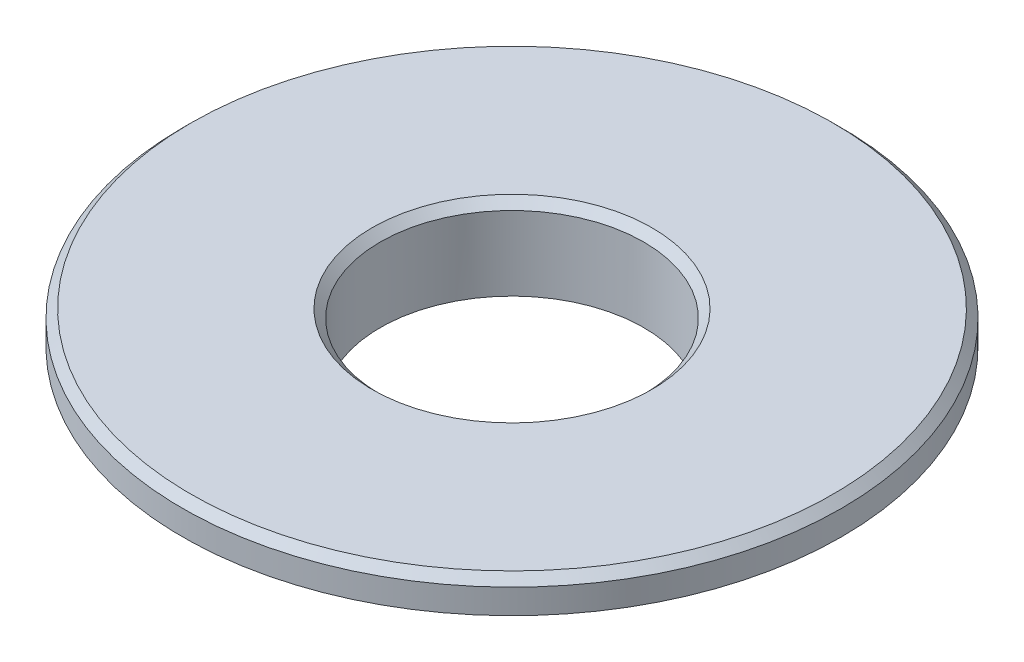
ISO-10303-21;
HEADER;
FILE_DESCRIPTION(('STEP AP214'),'2;1');
FILE_NAME('part.step','',(''),(''),'','','');
FILE_SCHEMA(('AUTOMOTIVE_DESIGN { 1 0 10303 214 1 1 1 1 }'));
ENDSEC;
DATA;
#1=APPLICATION_CONTEXT('core data for automotive mechanical design processes');
#2=APPLICATION_PROTOCOL_DEFINITION('international standard','automotive_design',2000,#1);
#3=PRODUCT_CONTEXT('',#1,'mechanical');
#4=PRODUCT('Part','Part','',(#3));
#5=PRODUCT_RELATED_PRODUCT_CATEGORY('part','',(#4));
#6=PRODUCT_DEFINITION_FORMATION('','',#4);
#7=PRODUCT_DEFINITION_CONTEXT('part definition',#1,'design');
#8=PRODUCT_DEFINITION('design','',#6,#7);
#9=PRODUCT_DEFINITION_SHAPE('','',#8);
#10=(LENGTH_UNIT() NAMED_UNIT(*) SI_UNIT(.MILLI.,.METRE.));
#11=(NAMED_UNIT(*) PLANE_ANGLE_UNIT() SI_UNIT($,.RADIAN.));
#12=(NAMED_UNIT(*) SI_UNIT($,.STERADIAN.) SOLID_ANGLE_UNIT());
#13=UNCERTAINTY_MEASURE_WITH_UNIT(LENGTH_MEASURE(1.E-05),#10,'distance_accuracy_value','');
#14=(GEOMETRIC_REPRESENTATION_CONTEXT(3) GLOBAL_UNCERTAINTY_ASSIGNED_CONTEXT((#13)) GLOBAL_UNIT_ASSIGNED_CONTEXT((#10,
#11,#12)) REPRESENTATION_CONTEXT('',''));
#15=CARTESIAN_POINT('',(0.,0.,0.));
#16=DIRECTION('',(0.,0.,1.));
#17=DIRECTION('',(1.,0.,0.));
#18=AXIS2_PLACEMENT_3D('',#15,#16,#17);
#19=CARTESIAN_POINT('',(0.,-42.9737261146497,0.));
#20=DIRECTION('',(0.,-1.,0.));
#21=DIRECTION('',(1.,0.,0.));
#22=AXIS2_PLACEMENT_3D('',#19,#20,#21);
#23=CYLINDRICAL_SURFACE('',#22,8.);
#24=CARTESIAN_POINT('',(0.,-0.5,0.));
#25=DIRECTION('',(0.,1.,0.));
#26=DIRECTION('',(-1.,0.,0.));
#27=AXIS2_PLACEMENT_3D('',#24,#25,#26);
#28=CIRCLE('',#27,8.);
#29=CARTESIAN_POINT('',(-7.99999999999999,-0.500000000000002,0.));
#30=VERTEX_POINT('',#29);
#31=EDGE_CURVE('E40',#30,#30,#28,.T.);
#32=ORIENTED_EDGE('',*,*,#31,.T.);
#33=EDGE_LOOP('',(#32));
#34=FACE_BOUND('',#33,.T.);
#35=CARTESIAN_POINT('',(0.,-5.00000000000001,0.));
#36=DIRECTION('',(0.,-1.,0.));
#37=DIRECTION('',(1.,0.,0.));
#38=AXIS2_PLACEMENT_3D('',#35,#36,#37);
#39=CIRCLE('',#38,8.);
#40=CARTESIAN_POINT('',(8.00000000000001,-5.00000000000001,0.));
#41=VERTEX_POINT('',#40);
#42=EDGE_CURVE('E65',#41,#41,#39,.T.);
#43=ORIENTED_EDGE('',*,*,#42,.T.);
#44=EDGE_LOOP('',(#43));
#45=FACE_BOUND('',#44,.T.);
#46=ADVANCED_FACE('F33',(#34,#45),#23,.F.);
#47=CARTESIAN_POINT('',(8.,0.,0.));
#48=DIRECTION('',(0.,1.,0.));
#49=DIRECTION('',(-1.,0.,0.));
#50=AXIS2_PLACEMENT_3D('',#47,#48,#49);
#51=PLANE('',#50);
#52=CARTESIAN_POINT('',(0.,0.,0.));
#53=DIRECTION('',(0.,1.,0.));
#54=DIRECTION('',(-1.,0.,0.));
#55=AXIS2_PLACEMENT_3D('',#52,#53,#54);
#56=CIRCLE('',#55,8.49999999999999);
#57=CARTESIAN_POINT('',(-8.49999999999998,0.,0.));
#58=VERTEX_POINT('',#57);
#59=EDGE_CURVE('E44',#58,#58,#56,.F.);
#60=ORIENTED_EDGE('',*,*,#59,.T.);
#61=EDGE_LOOP('',(#60));
#62=FACE_BOUND('',#61,.T.);
#63=CARTESIAN_POINT('',(0.,0.,0.));
#64=DIRECTION('',(0.,1.,0.));
#65=DIRECTION('',(-1.,0.,0.));
#66=AXIS2_PLACEMENT_3D('',#63,#64,#65);
#67=CIRCLE('',#66,19.5);
#68=CARTESIAN_POINT('',(-19.5,0.,0.));
#69=VERTEX_POINT('',#68);
#70=EDGE_CURVE('E48',#69,#69,#67,.T.);
#71=ORIENTED_EDGE('',*,*,#70,.T.);
#72=EDGE_LOOP('',(#71));
#73=FACE_BOUND('',#72,.T.);
#74=ADVANCED_FACE('F87',(#62,#73),#51,.T.);
#75=CARTESIAN_POINT('',(0.,-42.9737261146497,0.));
#76=DIRECTION('',(0.,-1.,0.));
#77=DIRECTION('',(1.,0.,0.));
#78=AXIS2_PLACEMENT_3D('',#75,#76,#77);
#79=CYLINDRICAL_SURFACE('',#78,20.);
#80=CARTESIAN_POINT('',(0.,-0.500000000000014,0.));
#81=DIRECTION('',(0.,1.,0.));
#82=DIRECTION('',(-1.,0.,0.));
#83=AXIS2_PLACEMENT_3D('',#80,#81,#82);
#84=CIRCLE('',#83,20.);
#85=CARTESIAN_POINT('',(-20.,-0.500000000000018,0.));
#86=VERTEX_POINT('',#85);
#87=EDGE_CURVE('E10',#86,#86,#84,.F.);
#88=ORIENTED_EDGE('',*,*,#87,.T.);
#89=EDGE_LOOP('',(#88));
#90=FACE_BOUND('',#89,.T.);
#91=CARTESIAN_POINT('',(0.,-2.00000000000001,0.));
#92=DIRECTION('',(0.,-1.,0.));
#93=DIRECTION('',(1.,0.,0.));
#94=AXIS2_PLACEMENT_3D('',#91,#92,#93);
#95=CIRCLE('',#94,20.);
#96=CARTESIAN_POINT('',(20.,-2.00000000000001,0.));
#97=VERTEX_POINT('',#96);
#98=EDGE_CURVE('E59',#97,#97,#95,.T.);
#99=ORIENTED_EDGE('',*,*,#98,.F.);
#100=EDGE_LOOP('',(#99));
#101=FACE_BOUND('',#100,.T.);
#102=ADVANCED_FACE('F92',(#90,#101),#79,.T.);
#103=CARTESIAN_POINT('',(20.,-2.,0.));
#104=DIRECTION('',(0.,-1.,0.));
#105=DIRECTION('',(1.,0.,0.));
#106=AXIS2_PLACEMENT_3D('',#103,#104,#105);
#107=PLANE('',#106);
#108=ORIENTED_EDGE('',*,*,#98,.T.);
#109=EDGE_LOOP('',(#108));
#110=FACE_BOUND('',#109,.T.);
#111=CARTESIAN_POINT('',(0.,-2.00000000000001,0.));
#112=DIRECTION('',(0.,-1.,0.));
#113=DIRECTION('',(1.,0.,0.));
#114=AXIS2_PLACEMENT_3D('',#111,#112,#113);
#115=CIRCLE('',#114,9.5);
#116=CARTESIAN_POINT('',(9.50000000000001,-2.00000000000001,0.));
#117=VERTEX_POINT('',#116);
#118=EDGE_CURVE('E62',#117,#117,#115,.T.);
#119=ORIENTED_EDGE('',*,*,#118,.F.);
#120=EDGE_LOOP('',(#119));
#121=FACE_BOUND('',#120,.T.);
#122=ADVANCED_FACE('F83',(#110,#121),#107,.T.);
#123=CARTESIAN_POINT('',(0.,-42.9737261146497,0.));
#124=DIRECTION('',(0.,-1.,0.));
#125=DIRECTION('',(1.,0.,0.));
#126=AXIS2_PLACEMENT_3D('',#123,#124,#125);
#127=CYLINDRICAL_SURFACE('',#126,9.5);
#128=CARTESIAN_POINT('',(0.,-4.50000000000002,0.));
#129=DIRECTION('',(0.,-1.,0.));
#130=DIRECTION('',(1.,0.,0.));
#131=AXIS2_PLACEMENT_3D('',#128,#129,#130);
#132=CIRCLE('',#131,9.5);
#133=CARTESIAN_POINT('',(9.50000000000001,-4.50000000000002,0.));
#134=VERTEX_POINT('',#133);
#135=EDGE_CURVE('E53',#134,#134,#132,.F.);
#136=ORIENTED_EDGE('',*,*,#135,.T.);
#137=EDGE_LOOP('',(#136));
#138=FACE_BOUND('',#137,.T.);
#139=ORIENTED_EDGE('',*,*,#118,.T.);
#140=EDGE_LOOP('',(#139));
#141=FACE_BOUND('',#140,.T.);
#142=ADVANCED_FACE('F73',(#138,#141),#127,.T.);
#143=CARTESIAN_POINT('',(9.50000000000001,-5.00000000000001,0.));
#144=DIRECTION('',(0.,-1.,0.));
#145=DIRECTION('',(1.,0.,0.));
#146=AXIS2_PLACEMENT_3D('',#143,#144,#145);
#147=PLANE('',#146);
#148=CARTESIAN_POINT('',(0.,-5.00000000000001,0.));
#149=DIRECTION('',(0.,-1.,0.));
#150=DIRECTION('',(1.,0.,0.));
#151=AXIS2_PLACEMENT_3D('',#148,#149,#150);
#152=CIRCLE('',#151,9.);
#153=CARTESIAN_POINT('',(9.00000000000001,-5.00000000000001,0.));
#154=VERTEX_POINT('',#153);
#155=EDGE_CURVE('E56',#154,#154,#152,.T.);
#156=ORIENTED_EDGE('',*,*,#155,.T.);
#157=EDGE_LOOP('',(#156));
#158=FACE_BOUND('',#157,.T.);
#159=ORIENTED_EDGE('',*,*,#42,.F.);
#160=EDGE_LOOP('',(#159));
#161=FACE_BOUND('',#160,.T.);
#162=ADVANCED_FACE('F70',(#158,#161),#147,.T.);
#163=CARTESIAN_POINT('',(0.,-5.00000000000001,0.));
#164=DIRECTION('',(0.,1.,0.));
#165=DIRECTION('',(-1.,0.,0.));
#166=AXIS2_PLACEMENT_3D('',#163,#164,#165);
#167=CONICAL_SURFACE('',#166,9.,0.785398163397452);
#168=ORIENTED_EDGE('',*,*,#135,.F.);
#169=EDGE_LOOP('',(#168));
#170=FACE_BOUND('',#169,.T.);
#171=ORIENTED_EDGE('',*,*,#155,.F.);
#172=EDGE_LOOP('',(#171));
#173=FACE_BOUND('',#172,.T.);
#174=ADVANCED_FACE('F72',(#170,#173),#167,.T.);
#175=CARTESIAN_POINT('',(0.,0.,0.));
#176=DIRECTION('',(0.,1.,0.));
#177=DIRECTION('',(-1.,0.,0.));
#178=AXIS2_PLACEMENT_3D('',#175,#176,#177);
#179=CONICAL_SURFACE('',#178,8.49999999999999,0.785398163397441);
#180=ORIENTED_EDGE('',*,*,#31,.F.);
#181=EDGE_LOOP('',(#180));
#182=FACE_BOUND('',#181,.T.);
#183=ORIENTED_EDGE('',*,*,#59,.F.);
#184=EDGE_LOOP('',(#183));
#185=FACE_BOUND('',#184,.T.);
#186=ADVANCED_FACE('F80',(#182,#185),#179,.F.);
#187=CARTESIAN_POINT('',(0.,-0.500000000000007,0.));
#188=DIRECTION('',(0.,-1.,0.));
#189=DIRECTION('',(1.,0.,0.));
#190=AXIS2_PLACEMENT_3D('',#187,#188,#189);
#191=CONICAL_SURFACE('',#190,20.,0.785398163397452);
#192=ORIENTED_EDGE('',*,*,#70,.F.);
#193=EDGE_LOOP('',(#192));
#194=FACE_BOUND('',#193,.T.);
#195=ORIENTED_EDGE('',*,*,#87,.F.);
#196=EDGE_LOOP('',(#195));
#197=FACE_BOUND('',#196,.T.);
#198=ADVANCED_FACE('F35',(#194,#197),#191,.T.);
#199=CLOSED_SHELL('',(#46,#74,#102,#122,#142,#162,#174,#186,#198));
#200=MANIFOLD_SOLID_BREP('B2',#199);
#201=ADVANCED_BREP_SHAPE_REPRESENTATION('',(#18,#200),#14);
#202=SHAPE_DEFINITION_REPRESENTATION(#9,#201);
ENDSEC;
END-ISO-10303-21;
